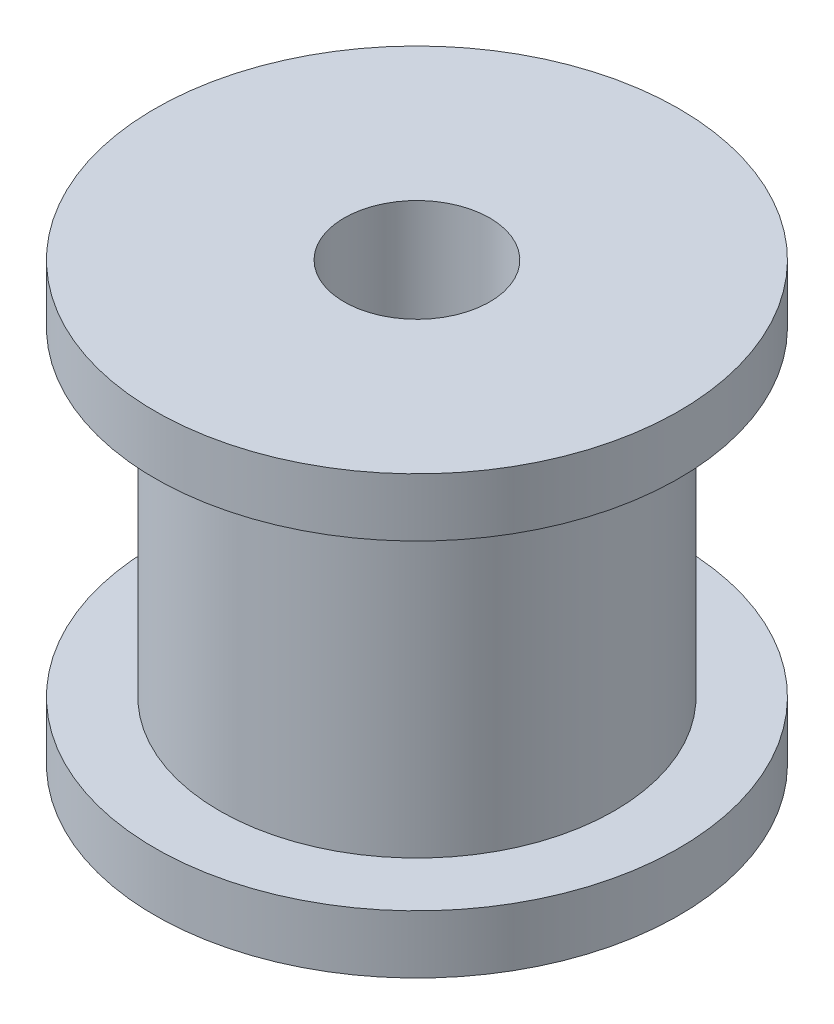
ISO-10303-21;
HEADER;
FILE_DESCRIPTION(('STEP AP214'),'2;1');
FILE_NAME('part.step','',(''),(''),'','','');
FILE_SCHEMA(('AUTOMOTIVE_DESIGN { 1 0 10303 214 1 1 1 1 }'));
ENDSEC;
DATA;
#1=APPLICATION_CONTEXT('core data for automotive mechanical design processes');
#2=APPLICATION_PROTOCOL_DEFINITION('international standard','automotive_design',2000,#1);
#3=PRODUCT_CONTEXT('',#1,'mechanical');
#4=PRODUCT('Part','Part','',(#3));
#5=PRODUCT_RELATED_PRODUCT_CATEGORY('part','',(#4));
#6=PRODUCT_DEFINITION_FORMATION('','',#4);
#7=PRODUCT_DEFINITION_CONTEXT('part definition',#1,'design');
#8=PRODUCT_DEFINITION('design','',#6,#7);
#9=PRODUCT_DEFINITION_SHAPE('','',#8);
#10=(LENGTH_UNIT() NAMED_UNIT(*) SI_UNIT(.MILLI.,.METRE.));
#11=(NAMED_UNIT(*) PLANE_ANGLE_UNIT() SI_UNIT($,.RADIAN.));
#12=(NAMED_UNIT(*) SI_UNIT($,.STERADIAN.) SOLID_ANGLE_UNIT());
#13=UNCERTAINTY_MEASURE_WITH_UNIT(LENGTH_MEASURE(1.E-05),#10,'distance_accuracy_value','');
#14=(GEOMETRIC_REPRESENTATION_CONTEXT(3) GLOBAL_UNCERTAINTY_ASSIGNED_CONTEXT((#13)) GLOBAL_UNIT_ASSIGNED_CONTEXT((#10,
#11,#12)) REPRESENTATION_CONTEXT('',''));
#15=CARTESIAN_POINT('',(0.,0.,0.));
#16=DIRECTION('',(0.,0.,1.));
#17=DIRECTION('',(1.,0.,0.));
#18=AXIS2_PLACEMENT_3D('',#15,#16,#17);
#19=CARTESIAN_POINT('',(0.,0.,0.));
#20=DIRECTION('',(0.,-1.,0.));
#21=DIRECTION('',(0.,0.,-1.));
#22=AXIS2_PLACEMENT_3D('',#19,#20,#21);
#23=CYLINDRICAL_SURFACE('',#22,2.5);
#24=CARTESIAN_POINT('',(0.,-7.5,0.));
#25=DIRECTION('',(0.,-1.,0.));
#26=DIRECTION('',(0.,0.,-1.));
#27=AXIS2_PLACEMENT_3D('',#24,#25,#26);
#28=CIRCLE('',#27,2.5);
#29=CARTESIAN_POINT('',(0.,-7.5,-2.5));
#30=VERTEX_POINT('',#29);
#31=EDGE_CURVE('E10',#30,#30,#28,.T.);
#32=ORIENTED_EDGE('',*,*,#31,.T.);
#33=EDGE_LOOP('',(#32));
#34=FACE_BOUND('',#33,.T.);
#35=CARTESIAN_POINT('',(0.,7.5,0.));
#36=DIRECTION('',(0.,-1.,0.));
#37=DIRECTION('',(0.,0.,-1.));
#38=AXIS2_PLACEMENT_3D('',#35,#36,#37);
#39=CIRCLE('',#38,2.5);
#40=CARTESIAN_POINT('',(0.,7.5,-2.5));
#41=VERTEX_POINT('',#40);
#42=EDGE_CURVE('E65',#41,#41,#39,.T.);
#43=ORIENTED_EDGE('',*,*,#42,.F.);
#44=EDGE_LOOP('',(#43));
#45=FACE_BOUND('',#44,.T.);
#46=ADVANCED_FACE('F37',(#34,#45),#23,.F.);
#47=CARTESIAN_POINT('',(2.5,-7.5,0.));
#48=DIRECTION('',(0.,-1.,0.));
#49=DIRECTION('',(0.,0.,-1.));
#50=AXIS2_PLACEMENT_3D('',#47,#48,#49);
#51=PLANE('',#50);
#52=CARTESIAN_POINT('',(0.,-7.5,0.));
#53=DIRECTION('',(0.,-1.,0.));
#54=DIRECTION('',(0.,0.,-1.));
#55=AXIS2_PLACEMENT_3D('',#52,#53,#54);
#56=CIRCLE('',#55,9.);
#57=CARTESIAN_POINT('',(0.,-7.5,-9.));
#58=VERTEX_POINT('',#57);
#59=EDGE_CURVE('E43',#58,#58,#56,.T.);
#60=ORIENTED_EDGE('',*,*,#59,.T.);
#61=EDGE_LOOP('',(#60));
#62=FACE_BOUND('',#61,.T.);
#63=ORIENTED_EDGE('',*,*,#31,.F.);
#64=EDGE_LOOP('',(#63));
#65=FACE_BOUND('',#64,.T.);
#66=ADVANCED_FACE('F73',(#62,#65),#51,.T.);
#67=CARTESIAN_POINT('',(0.,0.,0.));
#68=DIRECTION('',(0.,-1.,0.));
#69=DIRECTION('',(0.,0.,-1.));
#70=AXIS2_PLACEMENT_3D('',#67,#68,#69);
#71=CYLINDRICAL_SURFACE('',#70,9.);
#72=CARTESIAN_POINT('',(0.,-5.5,0.));
#73=DIRECTION('',(0.,-1.,0.));
#74=DIRECTION('',(0.,0.,-1.));
#75=AXIS2_PLACEMENT_3D('',#72,#73,#74);
#76=CIRCLE('',#75,9.);
#77=CARTESIAN_POINT('',(0.,-5.5,-9.));
#78=VERTEX_POINT('',#77);
#79=EDGE_CURVE('E47',#78,#78,#76,.T.);
#80=ORIENTED_EDGE('',*,*,#79,.T.);
#81=EDGE_LOOP('',(#80));
#82=FACE_BOUND('',#81,.T.);
#83=ORIENTED_EDGE('',*,*,#59,.F.);
#84=EDGE_LOOP('',(#83));
#85=FACE_BOUND('',#84,.T.);
#86=ADVANCED_FACE('F77',(#82,#85),#71,.T.);
#87=CARTESIAN_POINT('',(9.,-5.5,0.));
#88=DIRECTION('',(0.,1.,0.));
#89=DIRECTION('',(0.,0.,1.));
#90=AXIS2_PLACEMENT_3D('',#87,#88,#89);
#91=PLANE('',#90);
#92=CARTESIAN_POINT('',(0.,-5.5,0.));
#93=DIRECTION('',(0.,-1.,0.));
#94=DIRECTION('',(0.,0.,-1.));
#95=AXIS2_PLACEMENT_3D('',#92,#93,#94);
#96=CIRCLE('',#95,6.78);
#97=CARTESIAN_POINT('',(0.,-5.5,-6.78));
#98=VERTEX_POINT('',#97);
#99=EDGE_CURVE('E51',#98,#98,#96,.T.);
#100=ORIENTED_EDGE('',*,*,#99,.T.);
#101=EDGE_LOOP('',(#100));
#102=FACE_BOUND('',#101,.T.);
#103=ORIENTED_EDGE('',*,*,#79,.F.);
#104=EDGE_LOOP('',(#103));
#105=FACE_BOUND('',#104,.T.);
#106=ADVANCED_FACE('F81',(#102,#105),#91,.T.);
#107=CARTESIAN_POINT('',(0.,0.,0.));
#108=DIRECTION('',(0.,-1.,0.));
#109=DIRECTION('',(0.,0.,-1.));
#110=AXIS2_PLACEMENT_3D('',#107,#108,#109);
#111=CYLINDRICAL_SURFACE('',#110,6.78);
#112=CARTESIAN_POINT('',(0.,5.5,0.));
#113=DIRECTION('',(0.,-1.,0.));
#114=DIRECTION('',(0.,0.,-1.));
#115=AXIS2_PLACEMENT_3D('',#112,#113,#114);
#116=CIRCLE('',#115,6.78);
#117=CARTESIAN_POINT('',(0.,5.5,-6.78));
#118=VERTEX_POINT('',#117);
#119=EDGE_CURVE('E56',#118,#118,#116,.T.);
#120=ORIENTED_EDGE('',*,*,#119,.T.);
#121=EDGE_LOOP('',(#120));
#122=FACE_BOUND('',#121,.T.);
#123=ORIENTED_EDGE('',*,*,#99,.F.);
#124=EDGE_LOOP('',(#123));
#125=FACE_BOUND('',#124,.T.);
#126=ADVANCED_FACE('F88',(#122,#125),#111,.T.);
#127=CARTESIAN_POINT('',(9.,5.5,0.));
#128=DIRECTION('',(0.,-1.,0.));
#129=DIRECTION('',(0.,0.,-1.));
#130=AXIS2_PLACEMENT_3D('',#127,#128,#129);
#131=PLANE('',#130);
#132=CARTESIAN_POINT('',(0.,5.5,0.));
#133=DIRECTION('',(0.,-1.,0.));
#134=DIRECTION('',(0.,0.,-1.));
#135=AXIS2_PLACEMENT_3D('',#132,#133,#134);
#136=CIRCLE('',#135,9.);
#137=CARTESIAN_POINT('',(0.,5.5,-9.));
#138=VERTEX_POINT('',#137);
#139=EDGE_CURVE('E59',#138,#138,#136,.T.);
#140=ORIENTED_EDGE('',*,*,#139,.T.);
#141=EDGE_LOOP('',(#140));
#142=FACE_BOUND('',#141,.T.);
#143=ORIENTED_EDGE('',*,*,#119,.F.);
#144=EDGE_LOOP('',(#143));
#145=FACE_BOUND('',#144,.T.);
#146=ADVANCED_FACE('F92',(#142,#145),#131,.T.);
#147=CARTESIAN_POINT('',(0.,0.,0.));
#148=DIRECTION('',(0.,-1.,0.));
#149=DIRECTION('',(0.,0.,-1.));
#150=AXIS2_PLACEMENT_3D('',#147,#148,#149);
#151=CYLINDRICAL_SURFACE('',#150,9.);
#152=CARTESIAN_POINT('',(0.,7.5,0.));
#153=DIRECTION('',(0.,-1.,0.));
#154=DIRECTION('',(0.,0.,-1.));
#155=AXIS2_PLACEMENT_3D('',#152,#153,#154);
#156=CIRCLE('',#155,9.);
#157=CARTESIAN_POINT('',(0.,7.5,-9.));
#158=VERTEX_POINT('',#157);
#159=EDGE_CURVE('E62',#158,#158,#156,.T.);
#160=ORIENTED_EDGE('',*,*,#159,.T.);
#161=EDGE_LOOP('',(#160));
#162=FACE_BOUND('',#161,.T.);
#163=ORIENTED_EDGE('',*,*,#139,.F.);
#164=EDGE_LOOP('',(#163));
#165=FACE_BOUND('',#164,.T.);
#166=ADVANCED_FACE('F96',(#162,#165),#151,.T.);
#167=CARTESIAN_POINT('',(2.5,7.5,0.));
#168=DIRECTION('',(0.,1.,0.));
#169=DIRECTION('',(0.,0.,1.));
#170=AXIS2_PLACEMENT_3D('',#167,#168,#169);
#171=PLANE('',#170);
#172=ORIENTED_EDGE('',*,*,#42,.T.);
#173=EDGE_LOOP('',(#172));
#174=FACE_BOUND('',#173,.T.);
#175=ORIENTED_EDGE('',*,*,#159,.F.);
#176=EDGE_LOOP('',(#175));
#177=FACE_BOUND('',#176,.T.);
#178=ADVANCED_FACE('F69',(#174,#177),#171,.T.);
#179=CLOSED_SHELL('',(#46,#66,#86,#106,#126,#146,#166,#178));
#180=MANIFOLD_SOLID_BREP('B2',#179);
#181=ADVANCED_BREP_SHAPE_REPRESENTATION('',(#18,#180),#14);
#182=SHAPE_DEFINITION_REPRESENTATION(#9,#181);
ENDSEC;
END-ISO-10303-21;
